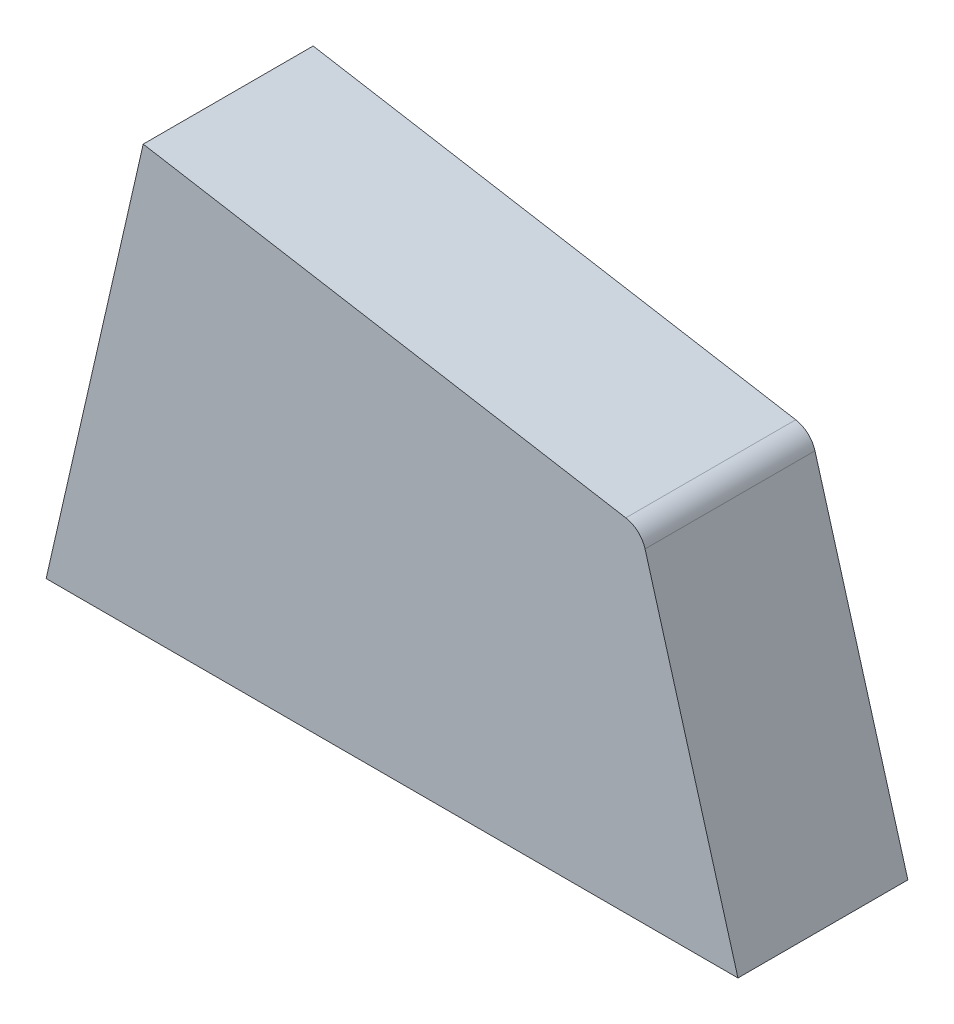
ISO-10303-21;
HEADER;
FILE_DESCRIPTION(('STEP AP214'),'2;1');
FILE_NAME('part.step','',(''),(''),'','','');
FILE_SCHEMA(('AUTOMOTIVE_DESIGN { 1 0 10303 214 1 1 1 1 }'));
ENDSEC;
DATA;
#1=APPLICATION_CONTEXT('core data for automotive mechanical design processes');
#2=APPLICATION_PROTOCOL_DEFINITION('international standard','automotive_design',2000,#1);
#3=PRODUCT_CONTEXT('',#1,'mechanical');
#4=PRODUCT('Part','Part','',(#3));
#5=PRODUCT_RELATED_PRODUCT_CATEGORY('part','',(#4));
#6=PRODUCT_DEFINITION_FORMATION('','',#4);
#7=PRODUCT_DEFINITION_CONTEXT('part definition',#1,'design');
#8=PRODUCT_DEFINITION('design','',#6,#7);
#9=PRODUCT_DEFINITION_SHAPE('','',#8);
#10=(LENGTH_UNIT() NAMED_UNIT(*) SI_UNIT(.MILLI.,.METRE.));
#11=(NAMED_UNIT(*) PLANE_ANGLE_UNIT() SI_UNIT($,.RADIAN.));
#12=(NAMED_UNIT(*) SI_UNIT($,.STERADIAN.) SOLID_ANGLE_UNIT());
#13=UNCERTAINTY_MEASURE_WITH_UNIT(LENGTH_MEASURE(1.E-05),#10,'distance_accuracy_value','');
#14=(GEOMETRIC_REPRESENTATION_CONTEXT(3) GLOBAL_UNCERTAINTY_ASSIGNED_CONTEXT((#13)) GLOBAL_UNIT_ASSIGNED_CONTEXT((#10,
#11,#12)) REPRESENTATION_CONTEXT('',''));
#15=CARTESIAN_POINT('',(0.,0.,0.));
#16=DIRECTION('',(0.,0.,1.));
#17=DIRECTION('',(1.,0.,0.));
#18=AXIS2_PLACEMENT_3D('',#15,#16,#17);
#19=CARTESIAN_POINT('',(12.,38.,14.));
#20=DIRECTION('',(0.974858506571867,-0.222824801502141,0.));
#21=DIRECTION('',(0.222824801502141,0.974858506571867,0.));
#22=AXIS2_PLACEMENT_3D('',#19,#20,#21);
#23=PLANE('',#22);
#24=DIRECTION('',(-0.222824801502141,-0.974858506571867,0.));
#25=VECTOR('',#24,1.);
#26=CARTESIAN_POINT('',(12.,38.,0.));
#27=LINE('',#26,#25);
#28=CARTESIAN_POINT('',(12.,38.,0.));
#29=VERTEX_POINT('',#28);
#30=CARTESIAN_POINT('',(4.,3.,0.));
#31=VERTEX_POINT('',#30);
#32=EDGE_CURVE('E110',#29,#31,#27,.T.);
#33=ORIENTED_EDGE('',*,*,#32,.T.);
#34=DIRECTION('',(0.,0.,-1.));
#35=VECTOR('',#34,1.);
#36=CARTESIAN_POINT('',(4.,3.,14.));
#37=LINE('',#36,#35);
#38=CARTESIAN_POINT('',(4.,3.,14.));
#39=VERTEX_POINT('',#38);
#40=EDGE_CURVE('E92',#39,#31,#37,.T.);
#41=ORIENTED_EDGE('',*,*,#40,.F.);
#42=DIRECTION('',(-0.222824801502141,-0.974858506571867,0.));
#43=VECTOR('',#42,1.);
#44=CARTESIAN_POINT('',(12.,38.,14.));
#45=LINE('',#44,#43);
#46=CARTESIAN_POINT('',(12.,38.,14.));
#47=VERTEX_POINT('',#46);
#48=EDGE_CURVE('E98',#47,#39,#45,.T.);
#49=ORIENTED_EDGE('',*,*,#48,.F.);
#50=DIRECTION('',(0.,0.,-1.));
#51=VECTOR('',#50,1.);
#52=CARTESIAN_POINT('',(12.,38.,14.));
#53=LINE('',#52,#51);
#54=EDGE_CURVE('E115',#47,#29,#53,.T.);
#55=ORIENTED_EDGE('',*,*,#54,.T.);
#56=EDGE_LOOP('',(#33,#41,#49,#55));
#57=FACE_BOUND('',#56,.T.);
#58=ADVANCED_FACE('F41',(#57),#23,.F.);
#59=CARTESIAN_POINT('',(4.,3.,14.));
#60=DIRECTION('',(0.,1.,0.));
#61=DIRECTION('',(0.,0.,1.));
#62=AXIS2_PLACEMENT_3D('',#59,#60,#61);
#63=PLANE('',#62);
#64=DIRECTION('',(1.,0.,0.));
#65=VECTOR('',#64,1.);
#66=CARTESIAN_POINT('',(4.,3.,0.));
#67=LINE('',#66,#65);
#68=CARTESIAN_POINT('',(61.,3.,0.));
#69=VERTEX_POINT('',#68);
#70=EDGE_CURVE('E123',#31,#69,#67,.T.);
#71=ORIENTED_EDGE('',*,*,#70,.T.);
#72=DIRECTION('',(0.,0.,-1.));
#73=VECTOR('',#72,1.);
#74=CARTESIAN_POINT('',(61.,3.,14.));
#75=LINE('',#74,#73);
#76=CARTESIAN_POINT('',(61.,3.,14.));
#77=VERTEX_POINT('',#76);
#78=EDGE_CURVE('E95',#77,#69,#75,.T.);
#79=ORIENTED_EDGE('',*,*,#78,.F.);
#80=DIRECTION('',(1.,0.,0.));
#81=VECTOR('',#80,1.);
#82=CARTESIAN_POINT('',(4.,3.,14.));
#83=LINE('',#82,#81);
#84=EDGE_CURVE('E88',#39,#77,#83,.T.);
#85=ORIENTED_EDGE('',*,*,#84,.F.);
#86=ORIENTED_EDGE('',*,*,#40,.T.);
#87=EDGE_LOOP('',(#71,#79,#85,#86));
#88=FACE_BOUND('',#87,.T.);
#89=ADVANCED_FACE('F90',(#88),#63,.F.);
#90=CARTESIAN_POINT('',(61.,3.,14.));
#91=DIRECTION('',(-0.961523947640823,-0.274721127897378,0.));
#92=DIRECTION('',(0.274721127897378,-0.961523947640823,0.));
#93=AXIS2_PLACEMENT_3D('',#90,#91,#92);
#94=PLANE('',#93);
#95=DIRECTION('',(-0.274721127897378,0.961523947640823,0.));
#96=VECTOR('',#95,1.);
#97=CARTESIAN_POINT('',(61.,3.,0.));
#98=LINE('',#97,#96);
#99=CARTESIAN_POINT('',(53.3457734037933,29.7897930867235,0.));
#100=VERTEX_POINT('',#99);
#101=EDGE_CURVE('E121',#69,#100,#98,.T.);
#102=ORIENTED_EDGE('',*,*,#101,.T.);
#103=DIRECTION('',(0.,0.,-1.));
#104=VECTOR('',#103,1.);
#105=CARTESIAN_POINT('',(53.3457734037933,29.7897930867234,14.));
#106=LINE('',#105,#104);
#107=CARTESIAN_POINT('',(53.3457734037933,29.7897930867235,14.));
#108=VERTEX_POINT('',#107);
#109=EDGE_CURVE('E49',#100,#108,#106,.F.);
#110=ORIENTED_EDGE('',*,*,#109,.T.);
#111=DIRECTION('',(-0.274721127897378,0.961523947640823,0.));
#112=VECTOR('',#111,1.);
#113=CARTESIAN_POINT('',(61.,3.,14.));
#114=LINE('',#113,#112);
#115=EDGE_CURVE('E97',#77,#108,#114,.T.);
#116=ORIENTED_EDGE('',*,*,#115,.F.);
#117=ORIENTED_EDGE('',*,*,#78,.T.);
#118=EDGE_LOOP('',(#102,#110,#116,#117));
#119=FACE_BOUND('',#118,.T.);
#120=ADVANCED_FACE('F133',(#119),#94,.F.);
#121=CARTESIAN_POINT('',(53.,31.,14.));
#122=DIRECTION('',(-0.168296462892021,-0.985736425510407,0.));
#123=DIRECTION('',(0.985736425510407,-0.168296462892021,0.));
#124=AXIS2_PLACEMENT_3D('',#121,#122,#123);
#125=PLANE('',#124);
#126=DIRECTION('',(-0.985736425510407,0.168296462892021,0.));
#127=VECTOR('',#126,1.);
#128=CARTESIAN_POINT('',(53.,31.,14.));
#129=LINE('',#128,#127);
#130=CARTESIAN_POINT('',(51.7593184342957,31.2118236819495,14.));
#131=VERTEX_POINT('',#130);
#132=EDGE_CURVE('E103',#131,#47,#129,.T.);
#133=ORIENTED_EDGE('',*,*,#132,.F.);
#134=DIRECTION('',(0.,0.,-1.));
#135=VECTOR('',#134,1.);
#136=CARTESIAN_POINT('',(51.7593184342957,31.2118236819495,14.));
#137=LINE('',#136,#135);
#138=CARTESIAN_POINT('',(51.7593184342957,31.2118236819495,0.));
#139=VERTEX_POINT('',#138);
#140=EDGE_CURVE('E111',#131,#139,#137,.T.);
#141=ORIENTED_EDGE('',*,*,#140,.T.);
#142=DIRECTION('',(-0.985736425510407,0.168296462892021,0.));
#143=VECTOR('',#142,1.);
#144=CARTESIAN_POINT('',(53.,31.,0.));
#145=LINE('',#144,#143);
#146=EDGE_CURVE('E107',#139,#29,#145,.T.);
#147=ORIENTED_EDGE('',*,*,#146,.T.);
#148=ORIENTED_EDGE('',*,*,#54,.F.);
#149=EDGE_LOOP('',(#133,#141,#147,#148));
#150=FACE_BOUND('',#149,.T.);
#151=ADVANCED_FACE('F131',(#150),#125,.F.);
#152=CARTESIAN_POINT('',(0.,0.,14.));
#153=DIRECTION('',(0.,0.,-1.));
#154=DIRECTION('',(-1.,0.,0.));
#155=AXIS2_PLACEMENT_3D('',#152,#153,#154);
#156=PLANE('',#155);
#157=ORIENTED_EDGE('',*,*,#115,.T.);
#158=CARTESIAN_POINT('',(51.4227255085117,29.2403508309287,14.));
#159=DIRECTION('',(0.,0.,-1.));
#160=DIRECTION('',(-1.,0.,0.));
#161=AXIS2_PLACEMENT_3D('',#158,#159,#160);
#162=CIRCLE('',#161,2.);
#163=EDGE_CURVE('E11',#108,#131,#162,.F.);
#164=ORIENTED_EDGE('',*,*,#163,.T.);
#165=ORIENTED_EDGE('',*,*,#132,.T.);
#166=ORIENTED_EDGE('',*,*,#48,.T.);
#167=ORIENTED_EDGE('',*,*,#84,.T.);
#168=EDGE_LOOP('',(#157,#164,#165,#166,#167));
#169=FACE_BOUND('',#168,.T.);
#170=ADVANCED_FACE('F101',(#169),#156,.F.);
#171=CARTESIAN_POINT('',(0.,0.,0.));
#172=DIRECTION('',(0.,0.,-1.));
#173=DIRECTION('',(-1.,0.,0.));
#174=AXIS2_PLACEMENT_3D('',#171,#172,#173);
#175=PLANE('',#174);
#176=ORIENTED_EDGE('',*,*,#146,.F.);
#177=CARTESIAN_POINT('',(51.4227255085117,29.2403508309287,0.));
#178=DIRECTION('',(0.,0.,-1.));
#179=DIRECTION('',(-1.,0.,0.));
#180=AXIS2_PLACEMENT_3D('',#177,#178,#179);
#181=CIRCLE('',#180,2.);
#182=EDGE_CURVE('E63',#139,#100,#181,.T.);
#183=ORIENTED_EDGE('',*,*,#182,.T.);
#184=ORIENTED_EDGE('',*,*,#101,.F.);
#185=ORIENTED_EDGE('',*,*,#70,.F.);
#186=ORIENTED_EDGE('',*,*,#32,.F.);
#187=EDGE_LOOP('',(#176,#183,#184,#185,#186));
#188=FACE_BOUND('',#187,.T.);
#189=ADVANCED_FACE('F132',(#188),#175,.T.);
#190=CARTESIAN_POINT('',(51.4227255085117,29.2403508309287,14.));
#191=DIRECTION('',(0.,0.,-1.));
#192=DIRECTION('',(-1.,0.,0.));
#193=AXIS2_PLACEMENT_3D('',#190,#191,#192);
#194=CYLINDRICAL_SURFACE('',#193,2.);
#195=ORIENTED_EDGE('',*,*,#163,.F.);
#196=ORIENTED_EDGE('',*,*,#109,.F.);
#197=ORIENTED_EDGE('',*,*,#182,.F.);
#198=ORIENTED_EDGE('',*,*,#140,.F.);
#199=EDGE_LOOP('',(#195,#196,#197,#198));
#200=FACE_BOUND('',#199,.T.);
#201=ADVANCED_FACE('F43',(#200),#194,.T.);
#202=CLOSED_SHELL('',(#58,#89,#120,#151,#170,#189,#201));
#203=MANIFOLD_SOLID_BREP('B2',#202);
#204=ADVANCED_BREP_SHAPE_REPRESENTATION('',(#18,#203),#14);
#205=SHAPE_DEFINITION_REPRESENTATION(#9,#204);
ENDSEC;
END-ISO-10303-21;
